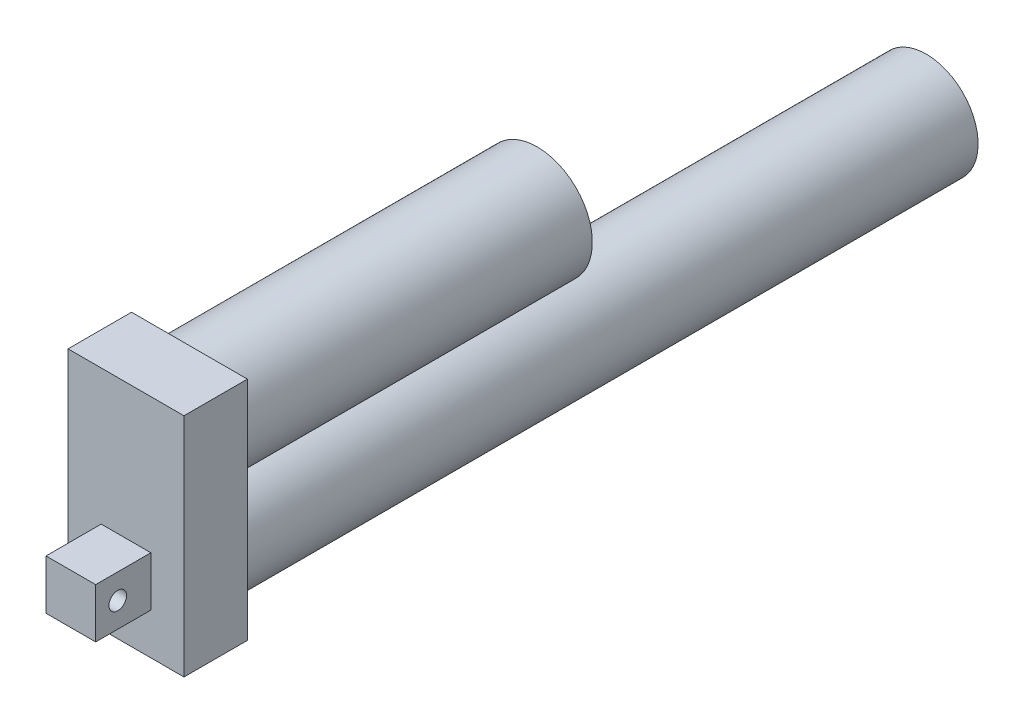
ISO-10303-21;
HEADER;
FILE_DESCRIPTION(('STEP AP214'),'2;1');
FILE_NAME('part.step','',(''),(''),'','','');
FILE_SCHEMA(('AUTOMOTIVE_DESIGN { 1 0 10303 214 1 1 1 1 }'));
ENDSEC;
DATA;
#1=APPLICATION_CONTEXT('core data for automotive mechanical design processes');
#2=APPLICATION_PROTOCOL_DEFINITION('international standard','automotive_design',2000,#1);
#3=PRODUCT_CONTEXT('',#1,'mechanical');
#4=PRODUCT('Part','Part','',(#3));
#5=PRODUCT_RELATED_PRODUCT_CATEGORY('part','',(#4));
#6=PRODUCT_DEFINITION_FORMATION('','',#4);
#7=PRODUCT_DEFINITION_CONTEXT('part definition',#1,'design');
#8=PRODUCT_DEFINITION('design','',#6,#7);
#9=PRODUCT_DEFINITION_SHAPE('','',#8);
#10=(LENGTH_UNIT() NAMED_UNIT(*) SI_UNIT(.MILLI.,.METRE.));
#11=(NAMED_UNIT(*) PLANE_ANGLE_UNIT() SI_UNIT($,.RADIAN.));
#12=(NAMED_UNIT(*) SI_UNIT($,.STERADIAN.) SOLID_ANGLE_UNIT());
#13=UNCERTAINTY_MEASURE_WITH_UNIT(LENGTH_MEASURE(1.E-05),#10,'distance_accuracy_value','');
#14=(GEOMETRIC_REPRESENTATION_CONTEXT(3) GLOBAL_UNCERTAINTY_ASSIGNED_CONTEXT((#13)) GLOBAL_UNIT_ASSIGNED_CONTEXT((#10,
#11,#12)) REPRESENTATION_CONTEXT('',''));
#15=CARTESIAN_POINT('',(0.,0.,0.));
#16=DIRECTION('',(0.,0.,1.));
#17=DIRECTION('',(1.,0.,0.));
#18=AXIS2_PLACEMENT_3D('',#15,#16,#17);
#19=CARTESIAN_POINT('',(0.,0.,23.));
#20=DIRECTION('',(0.,0.,-1.));
#21=DIRECTION('',(-1.,0.,0.));
#22=AXIS2_PLACEMENT_3D('',#19,#20,#21);
#23=PLANE('',#22);
#24=DIRECTION('',(0.,1.,0.));
#25=VECTOR('',#24,1.);
#26=CARTESIAN_POINT('',(21.,-41.,23.));
#27=LINE('',#26,#25);
#28=CARTESIAN_POINT('',(21.,-41.,23.));
#29=VERTEX_POINT('',#28);
#30=CARTESIAN_POINT('',(21.,41.,23.));
#31=VERTEX_POINT('',#30);
#32=EDGE_CURVE('E143',#29,#31,#27,.T.);
#33=ORIENTED_EDGE('',*,*,#32,.T.);
#34=DIRECTION('',(-1.,0.,0.));
#35=VECTOR('',#34,1.);
#36=CARTESIAN_POINT('',(-21.,41.,23.));
#37=LINE('',#36,#35);
#38=CARTESIAN_POINT('',(-21.,41.,23.));
#39=VERTEX_POINT('',#38);
#40=EDGE_CURVE('E147',#31,#39,#37,.T.);
#41=ORIENTED_EDGE('',*,*,#40,.T.);
#42=DIRECTION('',(0.,-1.,0.));
#43=VECTOR('',#42,1.);
#44=CARTESIAN_POINT('',(-21.,-41.,23.));
#45=LINE('',#44,#43);
#46=CARTESIAN_POINT('',(-21.,-41.,23.));
#47=VERTEX_POINT('',#46);
#48=EDGE_CURVE('E151',#39,#47,#45,.T.);
#49=ORIENTED_EDGE('',*,*,#48,.T.);
#50=DIRECTION('',(1.,0.,0.));
#51=VECTOR('',#50,1.);
#52=CARTESIAN_POINT('',(-21.,-41.,23.));
#53=LINE('',#52,#51);
#54=EDGE_CURVE('E154',#47,#29,#53,.T.);
#55=ORIENTED_EDGE('',*,*,#54,.T.);
#56=EDGE_LOOP('',(#33,#41,#49,#55));
#57=FACE_BOUND('',#56,.T.);
#58=DIRECTION('',(0.,1.,0.));
#59=VECTOR('',#58,1.);
#60=CARTESIAN_POINT('',(9.00000000000001,-7.99999999999999,23.));
#61=LINE('',#60,#59);
#62=CARTESIAN_POINT('',(9.00000000000001,-26.,23.));
#63=VERTEX_POINT('',#62);
#64=CARTESIAN_POINT('',(9.00000000000001,-7.99999999999999,23.));
#65=VERTEX_POINT('',#64);
#66=EDGE_CURVE('E130',#63,#65,#61,.T.);
#67=ORIENTED_EDGE('',*,*,#66,.F.);
#68=DIRECTION('',(1.,0.,0.));
#69=VECTOR('',#68,1.);
#70=CARTESIAN_POINT('',(-8.99999999999998,-26.,23.));
#71=LINE('',#70,#69);
#72=CARTESIAN_POINT('',(-8.99999999999998,-26.,23.));
#73=VERTEX_POINT('',#72);
#74=EDGE_CURVE('E127',#73,#63,#71,.T.);
#75=ORIENTED_EDGE('',*,*,#74,.F.);
#76=DIRECTION('',(0.,-1.,0.));
#77=VECTOR('',#76,1.);
#78=CARTESIAN_POINT('',(-8.99999999999999,-7.99999999999999,23.));
#79=LINE('',#78,#77);
#80=CARTESIAN_POINT('',(-8.99999999999999,-7.99999999999999,23.));
#81=VERTEX_POINT('',#80);
#82=EDGE_CURVE('E63',#81,#73,#79,.T.);
#83=ORIENTED_EDGE('',*,*,#82,.F.);
#84=DIRECTION('',(-1.,0.,0.));
#85=VECTOR('',#84,1.);
#86=CARTESIAN_POINT('',(-8.99999999999999,-7.99999999999999,23.));
#87=LINE('',#86,#85);
#88=EDGE_CURVE('E58',#65,#81,#87,.T.);
#89=ORIENTED_EDGE('',*,*,#88,.F.);
#90=EDGE_LOOP('',(#67,#75,#83,#89));
#91=FACE_BOUND('',#90,.T.);
#92=ADVANCED_FACE('F41',(#57,#91),#23,.F.);
#93=CARTESIAN_POINT('',(21.,-41.,23.));
#94=DIRECTION('',(-1.,0.,0.));
#95=DIRECTION('',(0.,0.,1.));
#96=AXIS2_PLACEMENT_3D('',#93,#94,#95);
#97=PLANE('',#96);
#98=DIRECTION('',(0.,1.,0.));
#99=VECTOR('',#98,1.);
#100=CARTESIAN_POINT('',(21.,-41.,0.));
#101=LINE('',#100,#99);
#102=CARTESIAN_POINT('',(21.,-41.,0.));
#103=VERTEX_POINT('',#102);
#104=CARTESIAN_POINT('',(21.,41.,0.));
#105=VERTEX_POINT('',#104);
#106=EDGE_CURVE('E132',#103,#105,#101,.T.);
#107=ORIENTED_EDGE('',*,*,#106,.T.);
#108=DIRECTION('',(0.,0.,-1.));
#109=VECTOR('',#108,1.);
#110=CARTESIAN_POINT('',(21.,41.,23.));
#111=LINE('',#110,#109);
#112=EDGE_CURVE('E11',#31,#105,#111,.T.);
#113=ORIENTED_EDGE('',*,*,#112,.F.);
#114=ORIENTED_EDGE('',*,*,#32,.F.);
#115=DIRECTION('',(0.,0.,-1.));
#116=VECTOR('',#115,1.);
#117=CARTESIAN_POINT('',(21.,-41.,23.));
#118=LINE('',#117,#116);
#119=EDGE_CURVE('E156',#29,#103,#118,.T.);
#120=ORIENTED_EDGE('',*,*,#119,.T.);
#121=EDGE_LOOP('',(#107,#113,#114,#120));
#122=FACE_BOUND('',#121,.T.);
#123=ADVANCED_FACE('F43',(#122),#97,.F.);
#124=CARTESIAN_POINT('',(-21.,41.,23.));
#125=DIRECTION('',(0.,-1.,0.));
#126=DIRECTION('',(0.,0.,-1.));
#127=AXIS2_PLACEMENT_3D('',#124,#125,#126);
#128=PLANE('',#127);
#129=DIRECTION('',(-1.,0.,0.));
#130=VECTOR('',#129,1.);
#131=CARTESIAN_POINT('',(-21.,41.,0.));
#132=LINE('',#131,#130);
#133=CARTESIAN_POINT('',(-21.,41.,0.));
#134=VERTEX_POINT('',#133);
#135=EDGE_CURVE('E137',#105,#134,#132,.T.);
#136=ORIENTED_EDGE('',*,*,#135,.T.);
#137=DIRECTION('',(0.,0.,-1.));
#138=VECTOR('',#137,1.);
#139=CARTESIAN_POINT('',(-21.,41.,23.));
#140=LINE('',#139,#138);
#141=EDGE_CURVE('E51',#39,#134,#140,.T.);
#142=ORIENTED_EDGE('',*,*,#141,.F.);
#143=ORIENTED_EDGE('',*,*,#40,.F.);
#144=ORIENTED_EDGE('',*,*,#112,.T.);
#145=EDGE_LOOP('',(#136,#142,#143,#144));
#146=FACE_BOUND('',#145,.T.);
#147=ADVANCED_FACE('F193',(#146),#128,.F.);
#148=CARTESIAN_POINT('',(-21.,-41.,23.));
#149=DIRECTION('',(1.,0.,0.));
#150=DIRECTION('',(0.,0.,-1.));
#151=AXIS2_PLACEMENT_3D('',#148,#149,#150);
#152=PLANE('',#151);
#153=DIRECTION('',(0.,-1.,0.));
#154=VECTOR('',#153,1.);
#155=CARTESIAN_POINT('',(-21.,-41.,0.));
#156=LINE('',#155,#154);
#157=CARTESIAN_POINT('',(-21.,-41.,0.));
#158=VERTEX_POINT('',#157);
#159=EDGE_CURVE('E160',#134,#158,#156,.T.);
#160=ORIENTED_EDGE('',*,*,#159,.T.);
#161=DIRECTION('',(0.,0.,-1.));
#162=VECTOR('',#161,1.);
#163=CARTESIAN_POINT('',(-21.,-41.,23.));
#164=LINE('',#163,#162);
#165=EDGE_CURVE('E168',#47,#158,#164,.T.);
#166=ORIENTED_EDGE('',*,*,#165,.F.);
#167=ORIENTED_EDGE('',*,*,#48,.F.);
#168=ORIENTED_EDGE('',*,*,#141,.T.);
#169=EDGE_LOOP('',(#160,#166,#167,#168));
#170=FACE_BOUND('',#169,.T.);
#171=ADVANCED_FACE('F178',(#170),#152,.F.);
#172=CARTESIAN_POINT('',(-21.,-41.,23.));
#173=DIRECTION('',(0.,1.,0.));
#174=DIRECTION('',(0.,0.,1.));
#175=AXIS2_PLACEMENT_3D('',#172,#173,#174);
#176=PLANE('',#175);
#177=DIRECTION('',(1.,0.,0.));
#178=VECTOR('',#177,1.);
#179=CARTESIAN_POINT('',(-21.,-41.,0.));
#180=LINE('',#179,#178);
#181=EDGE_CURVE('E148',#158,#103,#180,.T.);
#182=ORIENTED_EDGE('',*,*,#181,.T.);
#183=ORIENTED_EDGE('',*,*,#119,.F.);
#184=ORIENTED_EDGE('',*,*,#54,.F.);
#185=ORIENTED_EDGE('',*,*,#165,.T.);
#186=EDGE_LOOP('',(#182,#183,#184,#185));
#187=FACE_BOUND('',#186,.T.);
#188=ADVANCED_FACE('F187',(#187),#176,.F.);
#189=CARTESIAN_POINT('',(0.,0.,0.));
#190=DIRECTION('',(0.,0.,-1.));
#191=DIRECTION('',(-1.,0.,0.));
#192=AXIS2_PLACEMENT_3D('',#189,#190,#191);
#193=PLANE('',#192);
#194=CARTESIAN_POINT('',(0.,20.4016870745126,0.));
#195=DIRECTION('',(0.,0.,-1.));
#196=DIRECTION('',(-1.,0.,0.));
#197=AXIS2_PLACEMENT_3D('',#194,#195,#196);
#198=CIRCLE('',#197,20.);
#199=CARTESIAN_POINT('',(-20.,20.4016870745126,0.));
#200=VERTEX_POINT('',#199);
#201=EDGE_CURVE('E397',#200,#200,#198,.T.);
#202=ORIENTED_EDGE('',*,*,#201,.F.);
#203=EDGE_LOOP('',(#202));
#204=FACE_BOUND('',#203,.T.);
#205=CARTESIAN_POINT('',(0.,-19.7789835037916,0.));
#206=DIRECTION('',(0.,0.,-1.));
#207=DIRECTION('',(-1.,0.,0.));
#208=AXIS2_PLACEMENT_3D('',#205,#206,#207);
#209=CIRCLE('',#208,18.8);
#210=CARTESIAN_POINT('',(-18.8,-19.7789835037916,0.));
#211=VERTEX_POINT('',#210);
#212=EDGE_CURVE('E402',#211,#211,#209,.T.);
#213=ORIENTED_EDGE('',*,*,#212,.F.);
#214=EDGE_LOOP('',(#213));
#215=FACE_BOUND('',#214,.T.);
#216=ORIENTED_EDGE('',*,*,#106,.F.);
#217=ORIENTED_EDGE('',*,*,#181,.F.);
#218=ORIENTED_EDGE('',*,*,#159,.F.);
#219=ORIENTED_EDGE('',*,*,#135,.F.);
#220=EDGE_LOOP('',(#216,#217,#218,#219));
#221=FACE_BOUND('',#220,.T.);
#222=ADVANCED_FACE('F184',(#204,#215,#221),#193,.T.);
#223=CARTESIAN_POINT('',(9.00000000000001,-7.99999999999999,43.));
#224=DIRECTION('',(-1.,0.,0.));
#225=DIRECTION('',(0.,-1.,0.));
#226=AXIS2_PLACEMENT_3D('',#223,#224,#225);
#227=PLANE('',#226);
#228=CARTESIAN_POINT('',(9.00000000000001,-17.,35.));
#229=DIRECTION('',(1.,0.,0.));
#230=DIRECTION('',(0.,1.,0.));
#231=AXIS2_PLACEMENT_3D('',#228,#229,#230);
#232=CIRCLE('',#231,3.2);
#233=CARTESIAN_POINT('',(9.00000000000001,-13.8,35.));
#234=VERTEX_POINT('',#233);
#235=EDGE_CURVE('E410',#234,#234,#232,.T.);
#236=ORIENTED_EDGE('',*,*,#235,.F.);
#237=EDGE_LOOP('',(#236));
#238=FACE_BOUND('',#237,.T.);
#239=ORIENTED_EDGE('',*,*,#66,.T.);
#240=DIRECTION('',(0.,0.,-1.));
#241=VECTOR('',#240,1.);
#242=CARTESIAN_POINT('',(9.00000000000001,-7.99999999999999,43.));
#243=LINE('',#242,#241);
#244=CARTESIAN_POINT('',(9.00000000000001,-7.99999999999999,43.));
#245=VERTEX_POINT('',#244);
#246=EDGE_CURVE('E109',#245,#65,#243,.T.);
#247=ORIENTED_EDGE('',*,*,#246,.F.);
#248=DIRECTION('',(0.,1.,0.));
#249=VECTOR('',#248,1.);
#250=CARTESIAN_POINT('',(9.00000000000001,-7.99999999999999,43.));
#251=LINE('',#250,#249);
#252=CARTESIAN_POINT('',(9.00000000000001,-26.,43.));
#253=VERTEX_POINT('',#252);
#254=EDGE_CURVE('E117',#253,#245,#251,.T.);
#255=ORIENTED_EDGE('',*,*,#254,.F.);
#256=DIRECTION('',(0.,0.,-1.));
#257=VECTOR('',#256,1.);
#258=CARTESIAN_POINT('',(9.00000000000001,-26.,43.));
#259=LINE('',#258,#257);
#260=EDGE_CURVE('E421',#253,#63,#259,.T.);
#261=ORIENTED_EDGE('',*,*,#260,.T.);
#262=EDGE_LOOP('',(#239,#247,#255,#261));
#263=FACE_BOUND('',#262,.T.);
#264=ADVANCED_FACE('F129',(#238,#263),#227,.F.);
#265=CARTESIAN_POINT('',(-8.99999999999999,-7.99999999999999,43.));
#266=DIRECTION('',(0.,-1.,0.));
#267=DIRECTION('',(0.,0.,-1.));
#268=AXIS2_PLACEMENT_3D('',#265,#266,#267);
#269=PLANE('',#268);
#270=ORIENTED_EDGE('',*,*,#88,.T.);
#271=DIRECTION('',(0.,0.,-1.));
#272=VECTOR('',#271,1.);
#273=CARTESIAN_POINT('',(-8.99999999999999,-7.99999999999999,43.));
#274=LINE('',#273,#272);
#275=CARTESIAN_POINT('',(-8.99999999999999,-7.99999999999999,43.));
#276=VERTEX_POINT('',#275);
#277=EDGE_CURVE('E112',#276,#81,#274,.T.);
#278=ORIENTED_EDGE('',*,*,#277,.F.);
#279=DIRECTION('',(-1.,0.,0.));
#280=VECTOR('',#279,1.);
#281=CARTESIAN_POINT('',(-8.99999999999999,-7.99999999999999,43.));
#282=LINE('',#281,#280);
#283=EDGE_CURVE('E105',#245,#276,#282,.T.);
#284=ORIENTED_EDGE('',*,*,#283,.F.);
#285=ORIENTED_EDGE('',*,*,#246,.T.);
#286=EDGE_LOOP('',(#270,#278,#284,#285));
#287=FACE_BOUND('',#286,.T.);
#288=ADVANCED_FACE('F107',(#287),#269,.F.);
#289=CARTESIAN_POINT('',(-8.99999999999999,-7.99999999999999,43.));
#290=DIRECTION('',(1.,0.,0.));
#291=DIRECTION('',(0.,1.,0.));
#292=AXIS2_PLACEMENT_3D('',#289,#290,#291);
#293=PLANE('',#292);
#294=CARTESIAN_POINT('',(-8.99999999999999,-17.,35.));
#295=DIRECTION('',(1.,0.,0.));
#296=DIRECTION('',(0.,1.,0.));
#297=AXIS2_PLACEMENT_3D('',#294,#295,#296);
#298=CIRCLE('',#297,3.2);
#299=CARTESIAN_POINT('',(-8.99999999999999,-13.8,35.));
#300=VERTEX_POINT('',#299);
#301=EDGE_CURVE('E45',#300,#300,#298,.T.);
#302=ORIENTED_EDGE('',*,*,#301,.T.);
#303=EDGE_LOOP('',(#302));
#304=FACE_BOUND('',#303,.T.);
#305=ORIENTED_EDGE('',*,*,#82,.T.);
#306=DIRECTION('',(0.,0.,-1.));
#307=VECTOR('',#306,1.);
#308=CARTESIAN_POINT('',(-8.99999999999998,-26.,43.));
#309=LINE('',#308,#307);
#310=CARTESIAN_POINT('',(-8.99999999999998,-26.,43.));
#311=VERTEX_POINT('',#310);
#312=EDGE_CURVE('E139',#311,#73,#309,.T.);
#313=ORIENTED_EDGE('',*,*,#312,.F.);
#314=DIRECTION('',(0.,-1.,0.));
#315=VECTOR('',#314,1.);
#316=CARTESIAN_POINT('',(-8.99999999999999,-7.99999999999999,43.));
#317=LINE('',#316,#315);
#318=EDGE_CURVE('E116',#276,#311,#317,.T.);
#319=ORIENTED_EDGE('',*,*,#318,.F.);
#320=ORIENTED_EDGE('',*,*,#277,.T.);
#321=EDGE_LOOP('',(#305,#313,#319,#320));
#322=FACE_BOUND('',#321,.T.);
#323=ADVANCED_FACE('F235',(#304,#322),#293,.F.);
#324=CARTESIAN_POINT('',(-8.99999999999998,-26.,43.));
#325=DIRECTION('',(0.,1.,0.));
#326=DIRECTION('',(0.,0.,1.));
#327=AXIS2_PLACEMENT_3D('',#324,#325,#326);
#328=PLANE('',#327);
#329=ORIENTED_EDGE('',*,*,#74,.T.);
#330=ORIENTED_EDGE('',*,*,#260,.F.);
#331=DIRECTION('',(1.,0.,0.));
#332=VECTOR('',#331,1.);
#333=CARTESIAN_POINT('',(-8.99999999999998,-26.,43.));
#334=LINE('',#333,#332);
#335=EDGE_CURVE('E122',#311,#253,#334,.T.);
#336=ORIENTED_EDGE('',*,*,#335,.F.);
#337=ORIENTED_EDGE('',*,*,#312,.T.);
#338=EDGE_LOOP('',(#329,#330,#336,#337));
#339=FACE_BOUND('',#338,.T.);
#340=ADVANCED_FACE('F241',(#339),#328,.F.);
#341=CARTESIAN_POINT('',(0.,0.,43.));
#342=DIRECTION('',(0.,0.,1.));
#343=DIRECTION('',(1.,0.,0.));
#344=AXIS2_PLACEMENT_3D('',#341,#342,#343);
#345=PLANE('',#344);
#346=ORIENTED_EDGE('',*,*,#254,.T.);
#347=ORIENTED_EDGE('',*,*,#283,.T.);
#348=ORIENTED_EDGE('',*,*,#318,.T.);
#349=ORIENTED_EDGE('',*,*,#335,.T.);
#350=EDGE_LOOP('',(#346,#347,#348,#349));
#351=FACE_BOUND('',#350,.T.);
#352=ADVANCED_FACE('F120',(#351),#345,.T.);
#353=CARTESIAN_POINT('',(-12.,-17.,35.));
#354=DIRECTION('',(1.,0.,0.));
#355=DIRECTION('',(0.,1.,0.));
#356=AXIS2_PLACEMENT_3D('',#353,#354,#355);
#357=CYLINDRICAL_SURFACE('',#356,3.2);
#358=CARTESIAN_POINT('',(9.00000000000001,-13.8,35.));
#359=CARTESIAN_POINT('',(8.81250000000001,-13.8,35.));
#360=CARTESIAN_POINT('',(8.62500000000001,-13.8,35.));
#361=CARTESIAN_POINT('',(8.25000000000001,-13.8,35.));
#362=CARTESIAN_POINT('',(8.06250000000001,-13.8,35.));
#363=CARTESIAN_POINT('',(7.68750000000001,-13.8,35.));
#364=CARTESIAN_POINT('',(7.50000000000001,-13.8,35.));
#365=CARTESIAN_POINT('',(7.12500000000001,-13.8,35.));
#366=CARTESIAN_POINT('',(6.93750000000001,-13.8,35.));
#367=CARTESIAN_POINT('',(6.56250000000001,-13.8,35.));
#368=CARTESIAN_POINT('',(6.37500000000001,-13.8,35.));
#369=CARTESIAN_POINT('',(6.00000000000001,-13.8,35.));
#370=CARTESIAN_POINT('',(5.81250000000001,-13.8,35.));
#371=CARTESIAN_POINT('',(5.43750000000001,-13.8,35.));
#372=CARTESIAN_POINT('',(5.25000000000001,-13.8,35.));
#373=CARTESIAN_POINT('',(4.87500000000001,-13.8,35.));
#374=CARTESIAN_POINT('',(4.68750000000001,-13.8,35.));
#375=CARTESIAN_POINT('',(4.31250000000001,-13.8,35.));
#376=CARTESIAN_POINT('',(4.12500000000001,-13.8,35.));
#377=CARTESIAN_POINT('',(3.75000000000001,-13.8,35.));
#378=CARTESIAN_POINT('',(3.56250000000001,-13.8,35.));
#379=CARTESIAN_POINT('',(3.18750000000001,-13.8,35.));
#380=CARTESIAN_POINT('',(3.00000000000001,-13.8,35.));
#381=CARTESIAN_POINT('',(2.62500000000001,-13.8,35.));
#382=CARTESIAN_POINT('',(2.43750000000001,-13.8,35.));
#383=CARTESIAN_POINT('',(2.06250000000001,-13.8,35.));
#384=CARTESIAN_POINT('',(1.87500000000001,-13.8,35.));
#385=CARTESIAN_POINT('',(1.50000000000001,-13.8,35.));
#386=CARTESIAN_POINT('',(1.31250000000001,-13.8,35.));
#387=CARTESIAN_POINT('',(0.937500000000015,-13.8,35.));
#388=CARTESIAN_POINT('',(0.750000000000015,-13.8,35.));
#389=CARTESIAN_POINT('',(0.375000000000014,-13.8,35.));
#390=CARTESIAN_POINT('',(0.187500000000014,-13.8,35.));
#391=CARTESIAN_POINT('',(-0.187499999999986,-13.8,35.));
#392=CARTESIAN_POINT('',(-0.374999999999986,-13.8,35.));
#393=CARTESIAN_POINT('',(-0.749999999999987,-13.8,35.));
#394=CARTESIAN_POINT('',(-0.937499999999987,-13.8,35.));
#395=CARTESIAN_POINT('',(-1.31249999999999,-13.8,35.));
#396=CARTESIAN_POINT('',(-1.49999999999999,-13.8,35.));
#397=CARTESIAN_POINT('',(-1.87499999999999,-13.8,35.));
#398=CARTESIAN_POINT('',(-2.06249999999999,-13.8,35.));
#399=CARTESIAN_POINT('',(-2.43749999999999,-13.8,35.));
#400=CARTESIAN_POINT('',(-2.62499999999999,-13.8,35.));
#401=CARTESIAN_POINT('',(-2.99999999999999,-13.8,35.));
#402=CARTESIAN_POINT('',(-3.18749999999999,-13.8,35.));
#403=CARTESIAN_POINT('',(-3.56249999999999,-13.8,35.));
#404=CARTESIAN_POINT('',(-3.74999999999999,-13.8,35.));
#405=CARTESIAN_POINT('',(-4.12499999999999,-13.8,35.));
#406=CARTESIAN_POINT('',(-4.31249999999999,-13.8,35.));
#407=CARTESIAN_POINT('',(-4.68749999999999,-13.8,35.));
#408=CARTESIAN_POINT('',(-4.87499999999999,-13.8,35.));
#409=CARTESIAN_POINT('',(-5.24999999999999,-13.8,35.));
#410=CARTESIAN_POINT('',(-5.43749999999999,-13.8,35.));
#411=CARTESIAN_POINT('',(-5.81249999999999,-13.8,35.));
#412=CARTESIAN_POINT('',(-5.99999999999999,-13.8,35.));
#413=CARTESIAN_POINT('',(-6.37499999999998,-13.8,35.));
#414=CARTESIAN_POINT('',(-6.56249999999998,-13.8,35.));
#415=CARTESIAN_POINT('',(-6.93749999999998,-13.8,35.));
#416=CARTESIAN_POINT('',(-7.12499999999998,-13.8,35.));
#417=CARTESIAN_POINT('',(-7.49999999999998,-13.8,35.));
#418=CARTESIAN_POINT('',(-7.68749999999999,-13.8,35.));
#419=CARTESIAN_POINT('',(-8.06249999999999,-13.8,35.));
#420=CARTESIAN_POINT('',(-8.24999999999998,-13.8,35.));
#421=CARTESIAN_POINT('',(-8.62499999999999,-13.8,35.));
#422=CARTESIAN_POINT('',(-8.81249999999999,-13.8,35.));
#423=CARTESIAN_POINT('',(-8.99999999999999,-13.8,35.));
#424=B_SPLINE_CURVE_WITH_KNOTS('',3,(#358,#359,#360,#361,#362,#363,#364,#365,#366,#367,#368,
#369,#370,#371,#372,#373,#374,#375,#376,#377,#378,#379,#380,#381,#382,#383,#384,#385,#386,#387,
#388,#389,#390,#391,#392,#393,#394,#395,#396,#397,#398,#399,#400,#401,#402,#403,#404,#405,#406,
#407,#408,#409,#410,#411,#412,#413,#414,#415,#416,#417,#418,#419,#420,#421,#422,#423),
.UNSPECIFIED.,.F.,.F.,(4,2,2,2,2,2,2,2,2,2,2,2,2,2,2,2,2,2,2,2,2,2,2,2,2,2,2,2,2,2,2,2,4),(0.,
0.5625,1.125,1.6875,2.25,2.8125,3.375,3.9375,4.5,5.0625,5.625,6.1875,6.75,7.3125,7.875,8.4375,
9.,9.5625,10.125,10.6875,11.25,11.8125,12.375,12.9375,13.5,14.0625,14.625,15.1875,15.75,16.3125,
16.875,17.4375,18.),.UNSPECIFIED.);
#425=EDGE_CURVE('BSEAM255',#234,#300,#424,.T.);
#426=ORIENTED_EDGE('',*,*,#235,.T.);
#427=ORIENTED_EDGE('',*,*,#301,.F.);
#428=ORIENTED_EDGE('',*,*,#425,.T.);
#429=ORIENTED_EDGE('',*,*,#425,.F.);
#430=EDGE_LOOP('',(#426,#428,#427,#429));
#431=FACE_BOUND('',#430,.T.);
#432=ADVANCED_FACE('F255',(#431),#357,.F.);
#433=CARTESIAN_POINT('',(0.,-19.7789835037916,-267.));
#434=DIRECTION('',(0.,0.,1.));
#435=DIRECTION('',(1.,0.,0.));
#436=AXIS2_PLACEMENT_3D('',#433,#434,#435);
#437=CYLINDRICAL_SURFACE('',#436,18.8);
#438=CARTESIAN_POINT('',(0.,-19.7789835037916,-267.));
#439=DIRECTION('',(0.,0.,-1.));
#440=DIRECTION('',(-1.,0.,0.));
#441=AXIS2_PLACEMENT_3D('',#438,#439,#440);
#442=CIRCLE('',#441,18.8);
#443=CARTESIAN_POINT('',(-18.8,-19.7789835037916,-267.));
#444=VERTEX_POINT('',#443);
#445=EDGE_CURVE('E406',#444,#444,#442,.T.);
#446=ORIENTED_EDGE('',*,*,#445,.F.);
#447=EDGE_LOOP('',(#446));
#448=FACE_BOUND('',#447,.T.);
#449=ORIENTED_EDGE('',*,*,#212,.T.);
#450=EDGE_LOOP('',(#449));
#451=FACE_BOUND('',#450,.T.);
#452=ADVANCED_FACE('F261',(#448,#451),#437,.T.);
#453=CARTESIAN_POINT('',(0.,-19.7789835037916,-267.));
#454=DIRECTION('',(0.,0.,-1.));
#455=DIRECTION('',(-1.,0.,0.));
#456=AXIS2_PLACEMENT_3D('',#453,#454,#455);
#457=PLANE('',#456);
#458=CARTESIAN_POINT('',(0.,-19.7789835037916,-267.));
#459=DIRECTION('',(0.,0.,-1.));
#460=DIRECTION('',(-1.,0.,0.));
#461=AXIS2_PLACEMENT_3D('',#458,#459,#460);
#462=CIRCLE('',#461,10.);
#463=CARTESIAN_POINT('',(-10.,-19.7789835037916,-267.));
#464=VERTEX_POINT('',#463);
#465=EDGE_CURVE('E393',#464,#464,#462,.T.);
#466=ORIENTED_EDGE('',*,*,#465,.F.);
#467=EDGE_LOOP('',(#466));
#468=FACE_BOUND('',#467,.T.);
#469=ORIENTED_EDGE('',*,*,#445,.T.);
#470=EDGE_LOOP('',(#469));
#471=FACE_BOUND('',#470,.T.);
#472=ADVANCED_FACE('F268',(#468,#471),#457,.T.);
#473=CARTESIAN_POINT('',(0.,20.4016870745126,-126.));
#474=DIRECTION('',(0.,0.,1.));
#475=DIRECTION('',(1.,0.,0.));
#476=AXIS2_PLACEMENT_3D('',#473,#474,#475);
#477=CYLINDRICAL_SURFACE('',#476,20.);
#478=CARTESIAN_POINT('',(0.,20.4016870745126,-126.));
#479=DIRECTION('',(0.,0.,-1.));
#480=DIRECTION('',(-1.,0.,0.));
#481=AXIS2_PLACEMENT_3D('',#478,#479,#480);
#482=CIRCLE('',#481,20.);
#483=CARTESIAN_POINT('',(-20.,20.4016870745126,-126.));
#484=VERTEX_POINT('',#483);
#485=EDGE_CURVE('E398',#484,#484,#482,.T.);
#486=ORIENTED_EDGE('',*,*,#485,.F.);
#487=EDGE_LOOP('',(#486));
#488=FACE_BOUND('',#487,.T.);
#489=ORIENTED_EDGE('',*,*,#201,.T.);
#490=EDGE_LOOP('',(#489));
#491=FACE_BOUND('',#490,.T.);
#492=ADVANCED_FACE('F276',(#488,#491),#477,.T.);
#493=CARTESIAN_POINT('',(0.,20.4016870745126,-126.));
#494=DIRECTION('',(0.,0.,-1.));
#495=DIRECTION('',(-1.,0.,0.));
#496=AXIS2_PLACEMENT_3D('',#493,#494,#495);
#497=PLANE('',#496);
#498=ORIENTED_EDGE('',*,*,#485,.T.);
#499=EDGE_LOOP('',(#498));
#500=FACE_BOUND('',#499,.T.);
#501=ADVANCED_FACE('F285',(#500),#497,.T.);
#502=CARTESIAN_POINT('',(0.,-19.7789835037916,-247.));
#503=DIRECTION('',(0.,0.,-1.));
#504=DIRECTION('',(-1.,0.,0.));
#505=AXIS2_PLACEMENT_3D('',#502,#503,#504);
#506=CYLINDRICAL_SURFACE('',#505,10.);
#507=CARTESIAN_POINT('',(0.,-19.7789835037916,-247.));
#508=DIRECTION('',(0.,0.,-1.));
#509=DIRECTION('',(-1.,0.,0.));
#510=AXIS2_PLACEMENT_3D('',#507,#508,#509);
#511=CIRCLE('',#510,10.);
#512=CARTESIAN_POINT('',(-10.,-19.7789835037916,-247.));
#513=VERTEX_POINT('',#512);
#514=EDGE_CURVE('E379',#513,#513,#511,.T.);
#515=ORIENTED_EDGE('',*,*,#514,.F.);
#516=EDGE_LOOP('',(#515));
#517=FACE_BOUND('',#516,.T.);
#518=ORIENTED_EDGE('',*,*,#465,.T.);
#519=EDGE_LOOP('',(#518));
#520=FACE_BOUND('',#519,.T.);
#521=ADVANCED_FACE('F292',(#517,#520),#506,.F.);
#522=CARTESIAN_POINT('',(0.,-19.7789835037916,0.));
#523=DIRECTION('',(0.,0.,-1.));
#524=DIRECTION('',(-1.,0.,0.));
#525=AXIS2_PLACEMENT_3D('',#522,#523,#524);
#526=CYLINDRICAL_SURFACE('',#525,14.);
#527=CARTESIAN_POINT('',(0.,-19.7789835037916,0.));
#528=DIRECTION('',(0.,0.,-1.));
#529=DIRECTION('',(-1.,0.,0.));
#530=AXIS2_PLACEMENT_3D('',#527,#528,#529);
#531=CIRCLE('',#530,14.);
#532=CARTESIAN_POINT('',(-14.,-19.7789835037916,0.));
#533=VERTEX_POINT('',#532);
#534=EDGE_CURVE('E385',#533,#533,#531,.T.);
#535=ORIENTED_EDGE('',*,*,#534,.F.);
#536=EDGE_LOOP('',(#535));
#537=FACE_BOUND('',#536,.T.);
#538=CARTESIAN_POINT('',(0.,-19.7789835037916,-247.));
#539=DIRECTION('',(0.,0.,-1.));
#540=DIRECTION('',(-1.,0.,0.));
#541=AXIS2_PLACEMENT_3D('',#538,#539,#540);
#542=CIRCLE('',#541,14.);
#543=CARTESIAN_POINT('',(-14.,-19.7789835037916,-247.));
#544=VERTEX_POINT('',#543);
#545=EDGE_CURVE('E382',#544,#544,#542,.T.);
#546=ORIENTED_EDGE('',*,*,#545,.T.);
#547=EDGE_LOOP('',(#546));
#548=FACE_BOUND('',#547,.T.);
#549=ADVANCED_FACE('F299',(#537,#548),#526,.F.);
#550=CARTESIAN_POINT('',(0.,-19.7789835037916,0.));
#551=DIRECTION('',(0.,0.,-1.));
#552=DIRECTION('',(-1.,0.,0.));
#553=AXIS2_PLACEMENT_3D('',#550,#551,#552);
#554=PLANE('',#553);
#555=ORIENTED_EDGE('',*,*,#534,.T.);
#556=EDGE_LOOP('',(#555));
#557=FACE_BOUND('',#556,.T.);
#558=ADVANCED_FACE('F307',(#557),#554,.T.);
#559=CARTESIAN_POINT('',(0.,-19.7789835037916,-247.));
#560=DIRECTION('',(0.,0.,-1.));
#561=DIRECTION('',(-1.,0.,0.));
#562=AXIS2_PLACEMENT_3D('',#559,#560,#561);
#563=PLANE('',#562);
#564=ORIENTED_EDGE('',*,*,#514,.T.);
#565=EDGE_LOOP('',(#564));
#566=FACE_BOUND('',#565,.T.);
#567=ORIENTED_EDGE('',*,*,#545,.F.);
#568=EDGE_LOOP('',(#567));
#569=FACE_BOUND('',#568,.T.);
#570=ADVANCED_FACE('F315',(#566,#569),#563,.F.);
#571=CLOSED_SHELL('',(#92,#123,#147,#171,#188,#222,#264,#288,#323,#340,#352,#432,#452,#472,#492,
#501,#521,#549,#558,#570));
#572=MANIFOLD_SOLID_BREP('B2',#571);
#573=ADVANCED_BREP_SHAPE_REPRESENTATION('',(#18,#572),#14);
#574=SHAPE_DEFINITION_REPRESENTATION(#9,#573);
ENDSEC;
END-ISO-10303-21;
